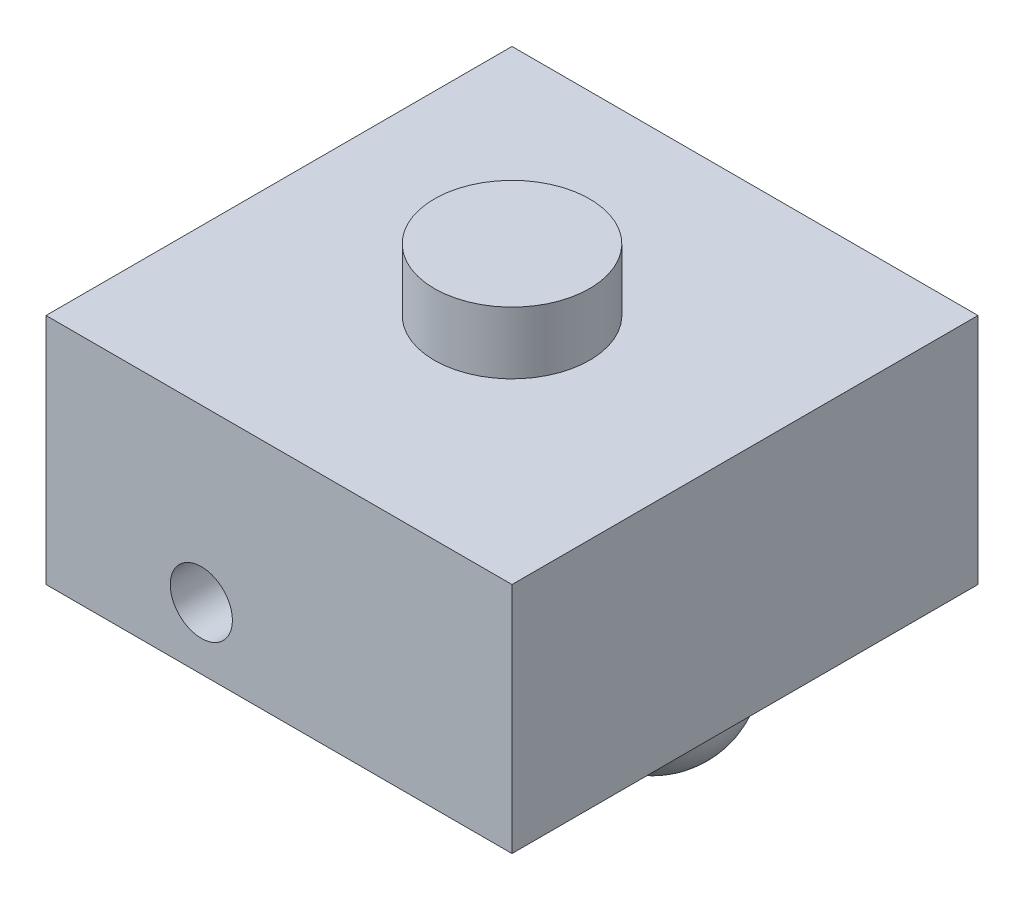
ISO-10303-21;
HEADER;
FILE_DESCRIPTION(('STEP AP214'),'2;1');
FILE_NAME('part.step','',(''),(''),'','','');
FILE_SCHEMA(('AUTOMOTIVE_DESIGN { 1 0 10303 214 1 1 1 1 }'));
ENDSEC;
DATA;
#1=APPLICATION_CONTEXT('core data for automotive mechanical design processes');
#2=APPLICATION_PROTOCOL_DEFINITION('international standard','automotive_design',2000,#1);
#3=PRODUCT_CONTEXT('',#1,'mechanical');
#4=PRODUCT('Part','Part','',(#3));
#5=PRODUCT_RELATED_PRODUCT_CATEGORY('part','',(#4));
#6=PRODUCT_DEFINITION_FORMATION('','',#4);
#7=PRODUCT_DEFINITION_CONTEXT('part definition',#1,'design');
#8=PRODUCT_DEFINITION('design','',#6,#7);
#9=PRODUCT_DEFINITION_SHAPE('','',#8);
#10=(LENGTH_UNIT() NAMED_UNIT(*) SI_UNIT(.MILLI.,.METRE.));
#11=(NAMED_UNIT(*) PLANE_ANGLE_UNIT() SI_UNIT($,.RADIAN.));
#12=(NAMED_UNIT(*) SI_UNIT($,.STERADIAN.) SOLID_ANGLE_UNIT());
#13=UNCERTAINTY_MEASURE_WITH_UNIT(LENGTH_MEASURE(1.E-05),#10,'distance_accuracy_value','');
#14=(GEOMETRIC_REPRESENTATION_CONTEXT(3) GLOBAL_UNCERTAINTY_ASSIGNED_CONTEXT((#13)) GLOBAL_UNIT_ASSIGNED_CONTEXT((#10,
#11,#12)) REPRESENTATION_CONTEXT('',''));
#15=CARTESIAN_POINT('',(0.,0.,0.));
#16=DIRECTION('',(0.,0.,1.));
#17=DIRECTION('',(1.,0.,0.));
#18=AXIS2_PLACEMENT_3D('',#15,#16,#17);
#19=CARTESIAN_POINT('',(150.,150.,-150.));
#20=DIRECTION('',(-1.,0.,0.));
#21=DIRECTION('',(0.,0.,1.));
#22=AXIS2_PLACEMENT_3D('',#19,#20,#21);
#23=PLANE('',#22);
#24=DIRECTION('',(0.,0.,-1.));
#25=VECTOR('',#24,1.);
#26=CARTESIAN_POINT('',(150.,0.,-150.));
#27=LINE('',#26,#25);
#28=CARTESIAN_POINT('',(150.,0.,150.));
#29=VERTEX_POINT('',#28);
#30=CARTESIAN_POINT('',(150.,0.,-150.));
#31=VERTEX_POINT('',#30);
#32=EDGE_CURVE('E114',#29,#31,#27,.T.);
#33=ORIENTED_EDGE('',*,*,#32,.T.);
#34=DIRECTION('',(0.,-1.,0.));
#35=VECTOR('',#34,1.);
#36=CARTESIAN_POINT('',(150.,150.,-150.));
#37=LINE('',#36,#35);
#38=CARTESIAN_POINT('',(150.,150.,-150.));
#39=VERTEX_POINT('',#38);
#40=EDGE_CURVE('E103',#39,#31,#37,.T.);
#41=ORIENTED_EDGE('',*,*,#40,.F.);
#42=DIRECTION('',(0.,0.,-1.));
#43=VECTOR('',#42,1.);
#44=CARTESIAN_POINT('',(150.,150.,-150.));
#45=LINE('',#44,#43);
#46=CARTESIAN_POINT('',(150.,150.,150.));
#47=VERTEX_POINT('',#46);
#48=EDGE_CURVE('E95',#47,#39,#45,.T.);
#49=ORIENTED_EDGE('',*,*,#48,.F.);
#50=DIRECTION('',(0.,-1.,0.));
#51=VECTOR('',#50,1.);
#52=CARTESIAN_POINT('',(150.,150.,150.));
#53=LINE('',#52,#51);
#54=EDGE_CURVE('E110',#47,#29,#53,.T.);
#55=ORIENTED_EDGE('',*,*,#54,.T.);
#56=EDGE_LOOP('',(#33,#41,#49,#55));
#57=FACE_BOUND('',#56,.T.);
#58=ADVANCED_FACE('F41',(#57),#23,.F.);
#59=CARTESIAN_POINT('',(-150.,150.,-150.));
#60=DIRECTION('',(0.,0.,1.));
#61=DIRECTION('',(1.,0.,0.));
#62=AXIS2_PLACEMENT_3D('',#59,#60,#61);
#63=PLANE('',#62);
#64=CARTESIAN_POINT('',(-50.,40.,-150.));
#65=DIRECTION('',(0.,0.,1.));
#66=DIRECTION('',(1.,0.,0.));
#67=AXIS2_PLACEMENT_3D('',#64,#65,#66);
#68=CIRCLE('',#67,20.);
#69=CARTESIAN_POINT('',(-30.,40.,-150.));
#70=VERTEX_POINT('',#69);
#71=EDGE_CURVE('E118',#70,#70,#68,.T.);
#72=ORIENTED_EDGE('',*,*,#71,.T.);
#73=EDGE_LOOP('',(#72));
#74=FACE_BOUND('',#73,.T.);
#75=DIRECTION('',(-1.,0.,0.));
#76=VECTOR('',#75,1.);
#77=CARTESIAN_POINT('',(-150.,0.,-150.));
#78=LINE('',#77,#76);
#79=CARTESIAN_POINT('',(-150.,0.,-150.));
#80=VERTEX_POINT('',#79);
#81=EDGE_CURVE('E101',#31,#80,#78,.T.);
#82=ORIENTED_EDGE('',*,*,#81,.T.);
#83=DIRECTION('',(0.,-1.,0.));
#84=VECTOR('',#83,1.);
#85=CARTESIAN_POINT('',(-150.,150.,-150.));
#86=LINE('',#85,#84);
#87=CARTESIAN_POINT('',(-150.,150.,-150.));
#88=VERTEX_POINT('',#87);
#89=EDGE_CURVE('E99',#88,#80,#86,.T.);
#90=ORIENTED_EDGE('',*,*,#89,.F.);
#91=DIRECTION('',(-1.,0.,0.));
#92=VECTOR('',#91,1.);
#93=CARTESIAN_POINT('',(-150.,150.,-150.));
#94=LINE('',#93,#92);
#95=EDGE_CURVE('E90',#39,#88,#94,.T.);
#96=ORIENTED_EDGE('',*,*,#95,.F.);
#97=ORIENTED_EDGE('',*,*,#40,.T.);
#98=EDGE_LOOP('',(#82,#90,#96,#97));
#99=FACE_BOUND('',#98,.T.);
#100=ADVANCED_FACE('F100',(#74,#99),#63,.F.);
#101=CARTESIAN_POINT('',(-150.,150.,-150.));
#102=DIRECTION('',(1.,0.,0.));
#103=DIRECTION('',(0.,0.,-1.));
#104=AXIS2_PLACEMENT_3D('',#101,#102,#103);
#105=PLANE('',#104);
#106=DIRECTION('',(0.,0.,1.));
#107=VECTOR('',#106,1.);
#108=CARTESIAN_POINT('',(-150.,0.,-150.));
#109=LINE('',#108,#107);
#110=CARTESIAN_POINT('',(-150.,0.,150.));
#111=VERTEX_POINT('',#110);
#112=EDGE_CURVE('E76',#80,#111,#109,.T.);
#113=ORIENTED_EDGE('',*,*,#112,.T.);
#114=DIRECTION('',(0.,-1.,0.));
#115=VECTOR('',#114,1.);
#116=CARTESIAN_POINT('',(-150.,150.,150.));
#117=LINE('',#116,#115);
#118=CARTESIAN_POINT('',(-150.,150.,150.));
#119=VERTEX_POINT('',#118);
#120=EDGE_CURVE('E104',#119,#111,#117,.T.);
#121=ORIENTED_EDGE('',*,*,#120,.F.);
#122=DIRECTION('',(0.,0.,1.));
#123=VECTOR('',#122,1.);
#124=CARTESIAN_POINT('',(-150.,150.,-150.));
#125=LINE('',#124,#123);
#126=EDGE_CURVE('E93',#88,#119,#125,.T.);
#127=ORIENTED_EDGE('',*,*,#126,.F.);
#128=ORIENTED_EDGE('',*,*,#89,.T.);
#129=EDGE_LOOP('',(#113,#121,#127,#128));
#130=FACE_BOUND('',#129,.T.);
#131=ADVANCED_FACE('F106',(#130),#105,.F.);
#132=CARTESIAN_POINT('',(-150.,150.,150.));
#133=DIRECTION('',(0.,0.,-1.));
#134=DIRECTION('',(-1.,0.,0.));
#135=AXIS2_PLACEMENT_3D('',#132,#133,#134);
#136=PLANE('',#135);
#137=CARTESIAN_POINT('',(-50.,40.,150.));
#138=DIRECTION('',(0.,0.,1.));
#139=DIRECTION('',(1.,0.,0.));
#140=AXIS2_PLACEMENT_3D('',#137,#138,#139);
#141=CIRCLE('',#140,20.);
#142=CARTESIAN_POINT('',(-30.,40.,150.));
#143=VERTEX_POINT('',#142);
#144=EDGE_CURVE('E192',#143,#143,#141,.T.);
#145=ORIENTED_EDGE('',*,*,#144,.F.);
#146=EDGE_LOOP('',(#145));
#147=FACE_BOUND('',#146,.T.);
#148=DIRECTION('',(1.,0.,0.));
#149=VECTOR('',#148,1.);
#150=CARTESIAN_POINT('',(-150.,0.,150.));
#151=LINE('',#150,#149);
#152=EDGE_CURVE('E82',#111,#29,#151,.T.);
#153=ORIENTED_EDGE('',*,*,#152,.T.);
#154=ORIENTED_EDGE('',*,*,#54,.F.);
#155=DIRECTION('',(1.,0.,0.));
#156=VECTOR('',#155,1.);
#157=CARTESIAN_POINT('',(-150.,150.,150.));
#158=LINE('',#157,#156);
#159=EDGE_CURVE('E59',#119,#47,#158,.T.);
#160=ORIENTED_EDGE('',*,*,#159,.F.);
#161=ORIENTED_EDGE('',*,*,#120,.T.);
#162=EDGE_LOOP('',(#153,#154,#160,#161));
#163=FACE_BOUND('',#162,.T.);
#164=ADVANCED_FACE('F159',(#147,#163),#136,.F.);
#165=CARTESIAN_POINT('',(0.,150.,0.));
#166=DIRECTION('',(0.,1.,0.));
#167=DIRECTION('',(0.,0.,1.));
#168=AXIS2_PLACEMENT_3D('',#165,#166,#167);
#169=PLANE('',#168);
#170=CARTESIAN_POINT('',(0.,150.,0.));
#171=DIRECTION('',(0.,1.,0.));
#172=DIRECTION('',(0.,0.,1.));
#173=AXIS2_PLACEMENT_3D('',#170,#171,#172);
#174=CIRCLE('',#173,50.);
#175=CARTESIAN_POINT('',(0.,150.,50.));
#176=VERTEX_POINT('',#175);
#177=EDGE_CURVE('E131',#176,#176,#174,.T.);
#178=ORIENTED_EDGE('',*,*,#177,.F.);
#179=EDGE_LOOP('',(#178));
#180=FACE_BOUND('',#179,.T.);
#181=ORIENTED_EDGE('',*,*,#48,.T.);
#182=ORIENTED_EDGE('',*,*,#95,.T.);
#183=ORIENTED_EDGE('',*,*,#126,.T.);
#184=ORIENTED_EDGE('',*,*,#159,.T.);
#185=EDGE_LOOP('',(#181,#182,#183,#184));
#186=FACE_BOUND('',#185,.T.);
#187=ADVANCED_FACE('F91',(#180,#186),#169,.T.);
#188=CARTESIAN_POINT('',(0.,0.,0.));
#189=DIRECTION('',(0.,1.,0.));
#190=DIRECTION('',(0.,0.,1.));
#191=AXIS2_PLACEMENT_3D('',#188,#189,#190);
#192=PLANE('',#191);
#193=CARTESIAN_POINT('',(90.,0.,0.));
#194=DIRECTION('',(0.,1.,0.));
#195=DIRECTION('',(0.,0.,1.));
#196=AXIS2_PLACEMENT_3D('',#193,#194,#195);
#197=CIRCLE('',#196,50.);
#198=CARTESIAN_POINT('',(90.,0.,50.));
#199=VERTEX_POINT('',#198);
#200=EDGE_CURVE('E132',#199,#199,#197,.F.);
#201=ORIENTED_EDGE('',*,*,#200,.F.);
#202=EDGE_LOOP('',(#201));
#203=FACE_BOUND('',#202,.T.);
#204=ORIENTED_EDGE('',*,*,#32,.F.);
#205=ORIENTED_EDGE('',*,*,#152,.F.);
#206=ORIENTED_EDGE('',*,*,#112,.F.);
#207=ORIENTED_EDGE('',*,*,#81,.F.);
#208=EDGE_LOOP('',(#204,#205,#206,#207));
#209=FACE_BOUND('',#208,.T.);
#210=ADVANCED_FACE('F163',(#203,#209),#192,.F.);
#211=CARTESIAN_POINT('',(-50.,40.,-150.));
#212=DIRECTION('',(0.,0.,1.));
#213=DIRECTION('',(1.,0.,0.));
#214=AXIS2_PLACEMENT_3D('',#211,#212,#213);
#215=CYLINDRICAL_SURFACE('',#214,20.);
#216=ORIENTED_EDGE('',*,*,#71,.F.);
#217=EDGE_LOOP('',(#216));
#218=FACE_BOUND('',#217,.T.);
#219=ORIENTED_EDGE('',*,*,#144,.T.);
#220=EDGE_LOOP('',(#219));
#221=FACE_BOUND('',#220,.T.);
#222=ADVANCED_FACE('F166',(#218,#221),#215,.F.);
#223=CARTESIAN_POINT('',(0.,190.,0.));
#224=DIRECTION('',(0.,-1.,0.));
#225=DIRECTION('',(0.,0.,-1.));
#226=AXIS2_PLACEMENT_3D('',#223,#224,#225);
#227=CYLINDRICAL_SURFACE('',#226,50.);
#228=CARTESIAN_POINT('',(0.,190.,0.));
#229=DIRECTION('',(0.,1.,0.));
#230=DIRECTION('',(0.,0.,1.));
#231=AXIS2_PLACEMENT_3D('',#228,#229,#230);
#232=CIRCLE('',#231,50.);
#233=CARTESIAN_POINT('',(0.,190.,50.));
#234=VERTEX_POINT('',#233);
#235=EDGE_CURVE('E196',#234,#234,#232,.T.);
#236=ORIENTED_EDGE('',*,*,#235,.F.);
#237=EDGE_LOOP('',(#236));
#238=FACE_BOUND('',#237,.T.);
#239=ORIENTED_EDGE('',*,*,#177,.T.);
#240=EDGE_LOOP('',(#239));
#241=FACE_BOUND('',#240,.T.);
#242=ADVANCED_FACE('F173',(#238,#241),#227,.T.);
#243=CARTESIAN_POINT('',(0.,190.,0.));
#244=DIRECTION('',(0.,1.,0.));
#245=DIRECTION('',(0.,0.,1.));
#246=AXIS2_PLACEMENT_3D('',#243,#244,#245);
#247=PLANE('',#246);
#248=ORIENTED_EDGE('',*,*,#235,.T.);
#249=EDGE_LOOP('',(#248));
#250=FACE_BOUND('',#249,.T.);
#251=ADVANCED_FACE('F177',(#250),#247,.T.);
#252=CARTESIAN_POINT('',(90.,-50.,0.));
#253=DIRECTION('',(0.,1.,0.));
#254=DIRECTION('',(0.,0.,1.));
#255=AXIS2_PLACEMENT_3D('',#252,#253,#254);
#256=CYLINDRICAL_SURFACE('',#255,50.);
#257=CARTESIAN_POINT('',(90.,-1.,0.));
#258=DIRECTION('',(0.,-1.,0.));
#259=DIRECTION('',(0.,0.,-1.));
#260=AXIS2_PLACEMENT_3D('',#257,#258,#259);
#261=CIRCLE('',#260,50.);
#262=CARTESIAN_POINT('',(90.,-1.,-50.));
#263=VERTEX_POINT('',#262);
#264=EDGE_CURVE('E11',#263,#263,#261,.F.);
#265=ORIENTED_EDGE('',*,*,#264,.T.);
#266=EDGE_LOOP('',(#265));
#267=FACE_BOUND('',#266,.T.);
#268=ORIENTED_EDGE('',*,*,#200,.T.);
#269=EDGE_LOOP('',(#268));
#270=FACE_BOUND('',#269,.T.);
#271=ADVANCED_FACE('F146',(#267,#270),#256,.T.);
#272=CARTESIAN_POINT('',(90.,-50.,0.));
#273=DIRECTION('',(0.,-1.,0.));
#274=DIRECTION('',(0.,0.,-1.));
#275=AXIS2_PLACEMENT_3D('',#272,#273,#274);
#276=PLANE('',#275);
#277=CARTESIAN_POINT('',(90.,-50.,0.));
#278=DIRECTION('',(0.,-1.,0.));
#279=DIRECTION('',(0.,0.,-1.));
#280=AXIS2_PLACEMENT_3D('',#277,#278,#279);
#281=CIRCLE('',#280,1.);
#282=CARTESIAN_POINT('',(90.,-50.,-1.));
#283=VERTEX_POINT('',#282);
#284=EDGE_CURVE('E51',#283,#283,#281,.T.);
#285=ORIENTED_EDGE('',*,*,#284,.T.);
#286=EDGE_LOOP('',(#285));
#287=FACE_BOUND('',#286,.T.);
#288=ADVANCED_FACE('F139',(#287),#276,.T.);
#289=CARTESIAN_POINT('',(90.,-1.,0.));
#290=DIRECTION('',(0.,-1.,0.));
#291=DIRECTION('',(0.,0.,-1.));
#292=AXIS2_PLACEMENT_3D('',#289,#290,#291);
#293=DEGENERATE_TOROIDAL_SURFACE('',#292,1.,49.,.T.);
#294=ORIENTED_EDGE('',*,*,#264,.F.);
#295=EDGE_LOOP('',(#294));
#296=FACE_BOUND('',#295,.T.);
#297=ORIENTED_EDGE('',*,*,#284,.F.);
#298=EDGE_LOOP('',(#297));
#299=FACE_BOUND('',#298,.T.);
#300=ADVANCED_FACE('F43',(#296,#299),#293,.T.);
#301=CLOSED_SHELL('',(#58,#100,#131,#164,#187,#210,#222,#242,#251,#271,#288,#300));
#302=MANIFOLD_SOLID_BREP('B2',#301);
#303=ADVANCED_BREP_SHAPE_REPRESENTATION('',(#18,#302),#14);
#304=SHAPE_DEFINITION_REPRESENTATION(#9,#303);
ENDSEC;
END-ISO-10303-21;
